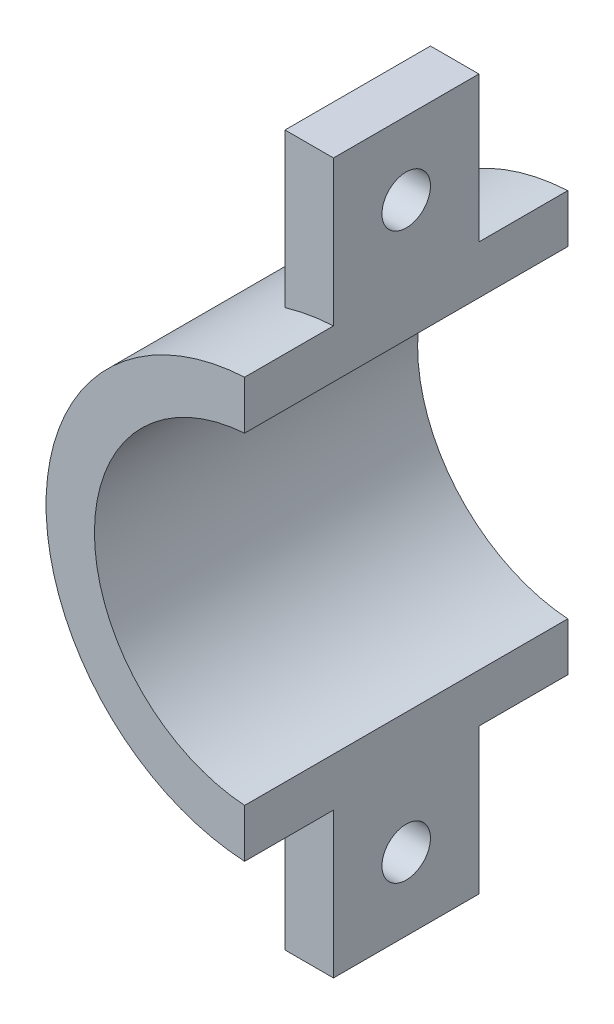
ISO-10303-21;
HEADER;
FILE_DESCRIPTION(('STEP AP214'),'2;1');
FILE_NAME('part.step','',(''),(''),'','','');
FILE_SCHEMA(('AUTOMOTIVE_DESIGN { 1 0 10303 214 1 1 1 1 }'));
ENDSEC;
DATA;
#1=APPLICATION_CONTEXT('core data for automotive mechanical design processes');
#2=APPLICATION_PROTOCOL_DEFINITION('international standard','automotive_design',2000,#1);
#3=PRODUCT_CONTEXT('',#1,'mechanical');
#4=PRODUCT('Part','Part','',(#3));
#5=PRODUCT_RELATED_PRODUCT_CATEGORY('part','',(#4));
#6=PRODUCT_DEFINITION_FORMATION('','',#4);
#7=PRODUCT_DEFINITION_CONTEXT('part definition',#1,'design');
#8=PRODUCT_DEFINITION('design','',#6,#7);
#9=PRODUCT_DEFINITION_SHAPE('','',#8);
#10=(LENGTH_UNIT() NAMED_UNIT(*) SI_UNIT(.MILLI.,.METRE.));
#11=(NAMED_UNIT(*) PLANE_ANGLE_UNIT() SI_UNIT($,.RADIAN.));
#12=(NAMED_UNIT(*) SI_UNIT($,.STERADIAN.) SOLID_ANGLE_UNIT());
#13=UNCERTAINTY_MEASURE_WITH_UNIT(LENGTH_MEASURE(1.E-05),#10,'distance_accuracy_value','');
#14=(GEOMETRIC_REPRESENTATION_CONTEXT(3) GLOBAL_UNCERTAINTY_ASSIGNED_CONTEXT((#13)) GLOBAL_UNIT_ASSIGNED_CONTEXT((#10,
#11,#12)) REPRESENTATION_CONTEXT('',''));
#15=CARTESIAN_POINT('',(0.,0.,0.));
#16=DIRECTION('',(0.,0.,1.));
#17=DIRECTION('',(1.,0.,0.));
#18=AXIS2_PLACEMENT_3D('',#15,#16,#17);
#19=CARTESIAN_POINT('',(0.,0.,20.));
#20=DIRECTION('',(0.,0.,-1.));
#21=DIRECTION('',(-1.,0.,0.));
#22=AXIS2_PLACEMENT_3D('',#19,#20,#21);
#23=CYLINDRICAL_SURFACE('',#22,10.0000000000001);
#24=CARTESIAN_POINT('',(0.,0.,0.));
#25=DIRECTION('',(0.,0.,-1.));
#26=DIRECTION('',(1.,0.,0.));
#27=AXIS2_PLACEMENT_3D('',#24,#25,#26);
#28=CIRCLE('',#27,10.0000000000001);
#29=CARTESIAN_POINT('',(-0.706664701255969,-9.97499999999999,0.));
#30=VERTEX_POINT('',#29);
#31=CARTESIAN_POINT('',(-0.706664701255889,9.975,0.));
#32=VERTEX_POINT('',#31);
#33=EDGE_CURVE('E209',#30,#32,#28,.T.);
#34=ORIENTED_EDGE('',*,*,#33,.T.);
#35=DIRECTION('',(0.,0.,-1.));
#36=VECTOR('',#35,1.);
#37=CARTESIAN_POINT('',(-0.706664701255889,9.975,20.));
#38=LINE('',#37,#36);
#39=CARTESIAN_POINT('',(-0.706664701255889,9.975,20.));
#40=VERTEX_POINT('',#39);
#41=EDGE_CURVE('E253',#40,#32,#38,.T.);
#42=ORIENTED_EDGE('',*,*,#41,.F.);
#43=CARTESIAN_POINT('',(0.,0.,20.));
#44=DIRECTION('',(0.,0.,-1.));
#45=DIRECTION('',(1.,0.,0.));
#46=AXIS2_PLACEMENT_3D('',#43,#44,#45);
#47=CIRCLE('',#46,10.0000000000001);
#48=CARTESIAN_POINT('',(-0.706664701255969,-9.97499999999999,20.));
#49=VERTEX_POINT('',#48);
#50=EDGE_CURVE('E213',#49,#40,#47,.T.);
#51=ORIENTED_EDGE('',*,*,#50,.F.);
#52=DIRECTION('',(0.,0.,-1.));
#53=VECTOR('',#52,1.);
#54=CARTESIAN_POINT('',(-0.706664701255969,-9.97499999999999,20.));
#55=LINE('',#54,#53);
#56=EDGE_CURVE('E227',#49,#30,#55,.T.);
#57=ORIENTED_EDGE('',*,*,#56,.T.);
#58=EDGE_LOOP('',(#34,#42,#51,#57));
#59=FACE_BOUND('',#58,.T.);
#60=ADVANCED_FACE('F39',(#59),#23,.F.);
#61=CARTESIAN_POINT('',(-0.706664701255889,9.975,20.));
#62=DIRECTION('',(-1.,0.,0.));
#63=DIRECTION('',(0.,0.,1.));
#64=AXIS2_PLACEMENT_3D('',#61,#62,#63);
#65=PLANE('',#64);
#66=DIRECTION('',(0.,0.,-1.));
#67=VECTOR('',#66,1.);
#68=CARTESIAN_POINT('',(-0.706664701255889,12.975,20.));
#69=LINE('',#68,#67);
#70=CARTESIAN_POINT('',(-0.706664701255889,12.975,5.5));
#71=VERTEX_POINT('',#70);
#72=CARTESIAN_POINT('',(-0.706664701255889,12.975,0.));
#73=VERTEX_POINT('',#72);
#74=EDGE_CURVE('E249',#71,#73,#69,.T.);
#75=ORIENTED_EDGE('',*,*,#74,.F.);
#76=DIRECTION('',(0.,1.,0.));
#77=VECTOR('',#76,1.);
#78=CARTESIAN_POINT('',(-0.706664701255889,21.975,5.5));
#79=LINE('',#78,#77);
#80=CARTESIAN_POINT('',(-0.706664701255889,21.975,5.5));
#81=VERTEX_POINT('',#80);
#82=EDGE_CURVE('E180',#71,#81,#79,.T.);
#83=ORIENTED_EDGE('',*,*,#82,.T.);
#84=DIRECTION('',(0.,0.,1.));
#85=VECTOR('',#84,1.);
#86=CARTESIAN_POINT('',(-0.706664701255889,21.975,14.5));
#87=LINE('',#86,#85);
#88=CARTESIAN_POINT('',(-0.706664701255889,21.975,14.5));
#89=VERTEX_POINT('',#88);
#90=EDGE_CURVE('E199',#81,#89,#87,.T.);
#91=ORIENTED_EDGE('',*,*,#90,.T.);
#92=DIRECTION('',(0.,-1.,0.));
#93=VECTOR('',#92,1.);
#94=CARTESIAN_POINT('',(-0.706664701255889,9.975,14.5));
#95=LINE('',#94,#93);
#96=CARTESIAN_POINT('',(-0.706664701255889,12.975,14.5));
#97=VERTEX_POINT('',#96);
#98=EDGE_CURVE('E188',#89,#97,#95,.T.);
#99=ORIENTED_EDGE('',*,*,#98,.T.);
#100=CARTESIAN_POINT('',(-0.706664701255889,12.975,20.));
#101=VERTEX_POINT('',#100);
#102=EDGE_CURVE('E250',#101,#97,#69,.T.);
#103=ORIENTED_EDGE('',*,*,#102,.F.);
#104=DIRECTION('',(0.,1.,0.));
#105=VECTOR('',#104,1.);
#106=CARTESIAN_POINT('',(-0.706664701255889,9.975,20.));
#107=LINE('',#106,#105);
#108=EDGE_CURVE('E217',#40,#101,#107,.T.);
#109=ORIENTED_EDGE('',*,*,#108,.F.);
#110=ORIENTED_EDGE('',*,*,#41,.T.);
#111=DIRECTION('',(0.,1.,0.));
#112=VECTOR('',#111,1.);
#113=CARTESIAN_POINT('',(-0.706664701255889,9.975,0.));
#114=LINE('',#113,#112);
#115=EDGE_CURVE('E231',#32,#73,#114,.T.);
#116=ORIENTED_EDGE('',*,*,#115,.T.);
#117=EDGE_LOOP('',(#75,#83,#91,#99,#103,#109,#110,#116));
#118=FACE_BOUND('',#117,.T.);
#119=CARTESIAN_POINT('',(-0.706664701255889,17.475,10.));
#120=DIRECTION('',(1.,0.,0.));
#121=DIRECTION('',(0.,0.,-1.));
#122=AXIS2_PLACEMENT_3D('',#119,#120,#121);
#123=CIRCLE('',#122,1.5);
#124=CARTESIAN_POINT('',(-0.706664701255889,17.475,8.5));
#125=VERTEX_POINT('',#124);
#126=EDGE_CURVE('E175',#125,#125,#123,.T.);
#127=ORIENTED_EDGE('',*,*,#126,.F.);
#128=EDGE_LOOP('',(#127));
#129=FACE_BOUND('',#128,.T.);
#130=ADVANCED_FACE('F286',(#118,#129),#65,.F.);
#131=CARTESIAN_POINT('',(0.,0.,20.));
#132=DIRECTION('',(0.,0.,-1.));
#133=DIRECTION('',(-1.,0.,0.));
#134=AXIS2_PLACEMENT_3D('',#131,#132,#133);
#135=CYLINDRICAL_SURFACE('',#134,12.9942294885076);
#136=DIRECTION('',(0.,0.,-1.));
#137=VECTOR('',#136,1.);
#138=CARTESIAN_POINT('',(-0.706664701255976,-12.975,20.));
#139=LINE('',#138,#137);
#140=CARTESIAN_POINT('',(-0.706664701255976,-12.975,5.5));
#141=VERTEX_POINT('',#140);
#142=CARTESIAN_POINT('',(-0.706664701255976,-12.975,0.));
#143=VERTEX_POINT('',#142);
#144=EDGE_CURVE('E244',#141,#143,#139,.T.);
#145=ORIENTED_EDGE('',*,*,#144,.F.);
#146=CARTESIAN_POINT('',(0.,0.,5.5));
#147=DIRECTION('',(0.,0.,-1.));
#148=DIRECTION('',(0.,1.,0.));
#149=AXIS2_PLACEMENT_3D('',#146,#147,#148);
#150=CIRCLE('',#149,12.9942294885076);
#151=CARTESIAN_POINT('',(-3.70666470125589,-12.4543420858938,5.5));
#152=VERTEX_POINT('',#151);
#153=EDGE_CURVE('E171',#141,#152,#150,.T.);
#154=ORIENTED_EDGE('',*,*,#153,.T.);
#155=DIRECTION('',(0.,0.,-1.));
#156=VECTOR('',#155,1.);
#157=CARTESIAN_POINT('',(-3.70666470125589,-12.4543420858938,20.));
#158=LINE('',#157,#156);
#159=CARTESIAN_POINT('',(-3.70666470125589,-12.4543420858938,14.5));
#160=VERTEX_POINT('',#159);
#161=EDGE_CURVE('E11',#160,#152,#158,.T.);
#162=ORIENTED_EDGE('',*,*,#161,.F.);
#163=CARTESIAN_POINT('',(0.,0.,14.5));
#164=DIRECTION('',(0.,0.,1.));
#165=DIRECTION('',(0.,-1.,0.));
#166=AXIS2_PLACEMENT_3D('',#163,#164,#165);
#167=CIRCLE('',#166,12.9942294885076);
#168=CARTESIAN_POINT('',(-0.706664701255889,-12.975,14.5));
#169=VERTEX_POINT('',#168);
#170=EDGE_CURVE('E135',#160,#169,#167,.T.);
#171=ORIENTED_EDGE('',*,*,#170,.T.);
#172=CARTESIAN_POINT('',(-0.706664701255976,-12.975,20.));
#173=VERTEX_POINT('',#172);
#174=EDGE_CURVE('E245',#173,#169,#139,.T.);
#175=ORIENTED_EDGE('',*,*,#174,.F.);
#176=CARTESIAN_POINT('',(0.,0.,20.));
#177=DIRECTION('',(0.,0.,1.));
#178=DIRECTION('',(1.,0.,0.));
#179=AXIS2_PLACEMENT_3D('',#176,#177,#178);
#180=CIRCLE('',#179,12.9942294885076);
#181=EDGE_CURVE('E221',#101,#173,#180,.T.);
#182=ORIENTED_EDGE('',*,*,#181,.F.);
#183=ORIENTED_EDGE('',*,*,#102,.T.);
#184=CARTESIAN_POINT('',(0.,0.,14.5));
#185=DIRECTION('',(0.,0.,1.));
#186=DIRECTION('',(1.,0.,0.));
#187=AXIS2_PLACEMENT_3D('',#184,#185,#186);
#188=CIRCLE('',#187,12.9942294885076);
#189=CARTESIAN_POINT('',(-3.70666470125589,12.4543420858938,14.5));
#190=VERTEX_POINT('',#189);
#191=EDGE_CURVE('E47',#97,#190,#188,.T.);
#192=ORIENTED_EDGE('',*,*,#191,.T.);
#193=DIRECTION('',(0.,0.,-1.));
#194=VECTOR('',#193,1.);
#195=CARTESIAN_POINT('',(-3.70666470125589,12.4543420858938,20.));
#196=LINE('',#195,#194);
#197=CARTESIAN_POINT('',(-3.70666470125589,12.4543420858938,5.5));
#198=VERTEX_POINT('',#197);
#199=EDGE_CURVE('E62',#190,#198,#196,.T.);
#200=ORIENTED_EDGE('',*,*,#199,.T.);
#201=CARTESIAN_POINT('',(0.,0.,5.5));
#202=DIRECTION('',(0.,0.,-1.));
#203=DIRECTION('',(0.,1.,0.));
#204=AXIS2_PLACEMENT_3D('',#201,#202,#203);
#205=CIRCLE('',#204,12.9942294885076);
#206=EDGE_CURVE('E258',#198,#71,#205,.T.);
#207=ORIENTED_EDGE('',*,*,#206,.T.);
#208=ORIENTED_EDGE('',*,*,#74,.T.);
#209=CARTESIAN_POINT('',(0.,0.,0.));
#210=DIRECTION('',(0.,0.,1.));
#211=DIRECTION('',(1.,0.,0.));
#212=AXIS2_PLACEMENT_3D('',#209,#210,#211);
#213=CIRCLE('',#212,12.9942294885076);
#214=EDGE_CURVE('E235',#73,#143,#213,.T.);
#215=ORIENTED_EDGE('',*,*,#214,.T.);
#216=EDGE_LOOP('',(#145,#154,#162,#171,#175,#182,#183,#192,#200,#207,#208,#215));
#217=FACE_BOUND('',#216,.T.);
#218=ADVANCED_FACE('F263',(#217),#135,.T.);
#219=CARTESIAN_POINT('',(-0.706664701255969,-9.97499999999999,20.));
#220=DIRECTION('',(-1.,0.,0.));
#221=DIRECTION('',(0.,0.,1.));
#222=AXIS2_PLACEMENT_3D('',#219,#220,#221);
#223=PLANE('',#222);
#224=ORIENTED_EDGE('',*,*,#174,.T.);
#225=DIRECTION('',(0.,-1.,0.));
#226=VECTOR('',#225,1.);
#227=CARTESIAN_POINT('',(-0.706664701255889,-9.97499999999999,14.5));
#228=LINE('',#227,#226);
#229=CARTESIAN_POINT('',(-0.706664701255889,-21.975,14.5));
#230=VERTEX_POINT('',#229);
#231=EDGE_CURVE('E159',#169,#230,#228,.T.);
#232=ORIENTED_EDGE('',*,*,#231,.T.);
#233=DIRECTION('',(0.,0.,-1.));
#234=VECTOR('',#233,1.);
#235=CARTESIAN_POINT('',(-0.706664701255889,-21.975,14.5));
#236=LINE('',#235,#234);
#237=CARTESIAN_POINT('',(-0.706664701255889,-21.975,5.5));
#238=VERTEX_POINT('',#237);
#239=EDGE_CURVE('E146',#230,#238,#236,.T.);
#240=ORIENTED_EDGE('',*,*,#239,.T.);
#241=DIRECTION('',(0.,1.,0.));
#242=VECTOR('',#241,1.);
#243=CARTESIAN_POINT('',(-0.706664701255889,-21.975,5.5));
#244=LINE('',#243,#242);
#245=EDGE_CURVE('E54',#238,#141,#244,.T.);
#246=ORIENTED_EDGE('',*,*,#245,.T.);
#247=ORIENTED_EDGE('',*,*,#144,.T.);
#248=DIRECTION('',(0.,1.,0.));
#249=VECTOR('',#248,1.);
#250=CARTESIAN_POINT('',(-0.706664701255969,-9.97499999999999,0.));
#251=LINE('',#250,#249);
#252=EDGE_CURVE('E218',#143,#30,#251,.T.);
#253=ORIENTED_EDGE('',*,*,#252,.T.);
#254=ORIENTED_EDGE('',*,*,#56,.F.);
#255=DIRECTION('',(0.,1.,0.));
#256=VECTOR('',#255,1.);
#257=CARTESIAN_POINT('',(-0.706664701255969,-9.97499999999999,20.));
#258=LINE('',#257,#256);
#259=EDGE_CURVE('E224',#173,#49,#258,.T.);
#260=ORIENTED_EDGE('',*,*,#259,.F.);
#261=EDGE_LOOP('',(#224,#232,#240,#246,#247,#253,#254,#260));
#262=FACE_BOUND('',#261,.T.);
#263=CARTESIAN_POINT('',(-0.706664701255889,-17.475,10.));
#264=DIRECTION('',(1.,0.,0.));
#265=DIRECTION('',(0.,0.,-1.));
#266=AXIS2_PLACEMENT_3D('',#263,#264,#265);
#267=CIRCLE('',#266,1.5);
#268=CARTESIAN_POINT('',(-0.706664701255889,-17.475,8.5));
#269=VERTEX_POINT('',#268);
#270=EDGE_CURVE('E351',#269,#269,#267,.T.);
#271=ORIENTED_EDGE('',*,*,#270,.F.);
#272=EDGE_LOOP('',(#271));
#273=FACE_BOUND('',#272,.T.);
#274=ADVANCED_FACE('F293',(#262,#273),#223,.F.);
#275=CARTESIAN_POINT('',(0.,0.,20.));
#276=DIRECTION('',(0.,0.,1.));
#277=DIRECTION('',(1.,0.,0.));
#278=AXIS2_PLACEMENT_3D('',#275,#276,#277);
#279=PLANE('',#278);
#280=ORIENTED_EDGE('',*,*,#50,.T.);
#281=ORIENTED_EDGE('',*,*,#108,.T.);
#282=ORIENTED_EDGE('',*,*,#181,.T.);
#283=ORIENTED_EDGE('',*,*,#259,.T.);
#284=EDGE_LOOP('',(#280,#281,#282,#283));
#285=FACE_BOUND('',#284,.T.);
#286=ADVANCED_FACE('F302',(#285),#279,.T.);
#287=CARTESIAN_POINT('',(0.,0.,0.));
#288=DIRECTION('',(0.,0.,1.));
#289=DIRECTION('',(1.,0.,0.));
#290=AXIS2_PLACEMENT_3D('',#287,#288,#289);
#291=PLANE('',#290);
#292=ORIENTED_EDGE('',*,*,#33,.F.);
#293=ORIENTED_EDGE('',*,*,#252,.F.);
#294=ORIENTED_EDGE('',*,*,#214,.F.);
#295=ORIENTED_EDGE('',*,*,#115,.F.);
#296=EDGE_LOOP('',(#292,#293,#294,#295));
#297=FACE_BOUND('',#296,.T.);
#298=ADVANCED_FACE('F291',(#297),#291,.F.);
#299=CARTESIAN_POINT('',(-3.70666470125589,0.,0.));
#300=DIRECTION('',(-1.,0.,0.));
#301=DIRECTION('',(0.,0.,1.));
#302=AXIS2_PLACEMENT_3D('',#299,#300,#301);
#303=PLANE('',#302);
#304=CARTESIAN_POINT('',(-3.70666470125589,17.475,10.));
#305=DIRECTION('',(1.,0.,0.));
#306=DIRECTION('',(0.,0.,-1.));
#307=AXIS2_PLACEMENT_3D('',#304,#305,#306);
#308=CIRCLE('',#307,1.5);
#309=CARTESIAN_POINT('',(-3.70666470125589,17.475,8.5));
#310=VERTEX_POINT('',#309);
#311=EDGE_CURVE('E176',#310,#310,#308,.T.);
#312=ORIENTED_EDGE('',*,*,#311,.T.);
#313=EDGE_LOOP('',(#312));
#314=FACE_BOUND('',#313,.T.);
#315=ORIENTED_EDGE('',*,*,#199,.F.);
#316=DIRECTION('',(0.,-1.,0.));
#317=VECTOR('',#316,1.);
#318=CARTESIAN_POINT('',(-3.70666470125589,9.975,14.5));
#319=LINE('',#318,#317);
#320=CARTESIAN_POINT('',(-3.70666470125589,21.975,14.5));
#321=VERTEX_POINT('',#320);
#322=EDGE_CURVE('E192',#321,#190,#319,.T.);
#323=ORIENTED_EDGE('',*,*,#322,.F.);
#324=DIRECTION('',(0.,0.,1.));
#325=VECTOR('',#324,1.);
#326=CARTESIAN_POINT('',(-3.70666470125589,21.975,14.5));
#327=LINE('',#326,#325);
#328=CARTESIAN_POINT('',(-3.70666470125589,21.975,5.5));
#329=VERTEX_POINT('',#328);
#330=EDGE_CURVE('E187',#329,#321,#327,.T.);
#331=ORIENTED_EDGE('',*,*,#330,.F.);
#332=DIRECTION('',(0.,1.,0.));
#333=VECTOR('',#332,1.);
#334=CARTESIAN_POINT('',(-3.70666470125589,21.975,5.5));
#335=LINE('',#334,#333);
#336=EDGE_CURVE('E184',#198,#329,#335,.T.);
#337=ORIENTED_EDGE('',*,*,#336,.F.);
#338=EDGE_LOOP('',(#315,#323,#331,#337));
#339=FACE_BOUND('',#338,.T.);
#340=ADVANCED_FACE('F271',(#314,#339),#303,.T.);
#341=CARTESIAN_POINT('',(-3.70666470125589,9.975,14.5));
#342=DIRECTION('',(0.,0.,1.));
#343=DIRECTION('',(1.,0.,0.));
#344=AXIS2_PLACEMENT_3D('',#341,#342,#343);
#345=PLANE('',#344);
#346=ORIENTED_EDGE('',*,*,#191,.F.);
#347=ORIENTED_EDGE('',*,*,#98,.F.);
#348=DIRECTION('',(1.,0.,0.));
#349=VECTOR('',#348,1.);
#350=CARTESIAN_POINT('',(-3.70666470125589,21.975,14.5));
#351=LINE('',#350,#349);
#352=EDGE_CURVE('E206',#321,#89,#351,.T.);
#353=ORIENTED_EDGE('',*,*,#352,.F.);
#354=ORIENTED_EDGE('',*,*,#322,.T.);
#355=EDGE_LOOP('',(#346,#347,#353,#354));
#356=FACE_BOUND('',#355,.T.);
#357=ADVANCED_FACE('F273',(#356),#345,.T.);
#358=CARTESIAN_POINT('',(-3.70666470125589,21.975,14.5));
#359=DIRECTION('',(0.,1.,0.));
#360=DIRECTION('',(0.,0.,1.));
#361=AXIS2_PLACEMENT_3D('',#358,#359,#360);
#362=PLANE('',#361);
#363=ORIENTED_EDGE('',*,*,#90,.F.);
#364=DIRECTION('',(1.,0.,0.));
#365=VECTOR('',#364,1.);
#366=CARTESIAN_POINT('',(-3.70666470125589,21.975,5.5));
#367=LINE('',#366,#365);
#368=EDGE_CURVE('E196',#329,#81,#367,.T.);
#369=ORIENTED_EDGE('',*,*,#368,.F.);
#370=ORIENTED_EDGE('',*,*,#330,.T.);
#371=ORIENTED_EDGE('',*,*,#352,.T.);
#372=EDGE_LOOP('',(#363,#369,#370,#371));
#373=FACE_BOUND('',#372,.T.);
#374=ADVANCED_FACE('F276',(#373),#362,.T.);
#375=CARTESIAN_POINT('',(-3.70666470125589,21.975,5.5));
#376=DIRECTION('',(0.,0.,-1.));
#377=DIRECTION('',(0.,1.,0.));
#378=AXIS2_PLACEMENT_3D('',#375,#376,#377);
#379=PLANE('',#378);
#380=ORIENTED_EDGE('',*,*,#206,.F.);
#381=ORIENTED_EDGE('',*,*,#336,.T.);
#382=ORIENTED_EDGE('',*,*,#368,.T.);
#383=ORIENTED_EDGE('',*,*,#82,.F.);
#384=EDGE_LOOP('',(#380,#381,#382,#383));
#385=FACE_BOUND('',#384,.T.);
#386=ADVANCED_FACE('F280',(#385),#379,.T.);
#387=CARTESIAN_POINT('',(-3.70666470125589,17.475,10.));
#388=DIRECTION('',(1.,0.,0.));
#389=DIRECTION('',(0.,0.,-1.));
#390=AXIS2_PLACEMENT_3D('',#387,#388,#389);
#391=CYLINDRICAL_SURFACE('',#390,1.5);
#392=ORIENTED_EDGE('',*,*,#311,.F.);
#393=EDGE_LOOP('',(#392));
#394=FACE_BOUND('',#393,.T.);
#395=ORIENTED_EDGE('',*,*,#126,.T.);
#396=EDGE_LOOP('',(#395));
#397=FACE_BOUND('',#396,.T.);
#398=ADVANCED_FACE('F321',(#394,#397),#391,.F.);
#399=CARTESIAN_POINT('',(-3.70666470125589,0.,0.));
#400=DIRECTION('',(1.,0.,0.));
#401=DIRECTION('',(0.,0.,-1.));
#402=AXIS2_PLACEMENT_3D('',#399,#400,#401);
#403=PLANE('',#402);
#404=CARTESIAN_POINT('',(-3.70666470125589,-17.475,10.));
#405=DIRECTION('',(1.,0.,0.));
#406=DIRECTION('',(0.,0.,-1.));
#407=AXIS2_PLACEMENT_3D('',#404,#405,#406);
#408=CIRCLE('',#407,1.5);
#409=CARTESIAN_POINT('',(-3.70666470125589,-17.475,8.5));
#410=VERTEX_POINT('',#409);
#411=EDGE_CURVE('E162',#410,#410,#408,.T.);
#412=ORIENTED_EDGE('',*,*,#411,.T.);
#413=EDGE_LOOP('',(#412));
#414=FACE_BOUND('',#413,.T.);
#415=DIRECTION('',(0.,-1.,0.));
#416=VECTOR('',#415,1.);
#417=CARTESIAN_POINT('',(-3.70666470125589,-9.97499999999999,14.5));
#418=LINE('',#417,#416);
#419=CARTESIAN_POINT('',(-3.70666470125589,-21.975,14.5));
#420=VERTEX_POINT('',#419);
#421=EDGE_CURVE('E129',#160,#420,#418,.T.);
#422=ORIENTED_EDGE('',*,*,#421,.F.);
#423=ORIENTED_EDGE('',*,*,#161,.T.);
#424=DIRECTION('',(0.,1.,0.));
#425=VECTOR('',#424,1.);
#426=CARTESIAN_POINT('',(-3.70666470125589,-21.975,5.5));
#427=LINE('',#426,#425);
#428=CARTESIAN_POINT('',(-3.70666470125589,-21.975,5.5));
#429=VERTEX_POINT('',#428);
#430=EDGE_CURVE('E149',#429,#152,#427,.T.);
#431=ORIENTED_EDGE('',*,*,#430,.F.);
#432=DIRECTION('',(0.,0.,-1.));
#433=VECTOR('',#432,1.);
#434=CARTESIAN_POINT('',(-3.70666470125589,-21.975,14.5));
#435=LINE('',#434,#433);
#436=EDGE_CURVE('E140',#420,#429,#435,.T.);
#437=ORIENTED_EDGE('',*,*,#436,.F.);
#438=EDGE_LOOP('',(#422,#423,#431,#437));
#439=FACE_BOUND('',#438,.T.);
#440=ADVANCED_FACE('F151',(#414,#439),#403,.F.);
#441=CARTESIAN_POINT('',(-3.70666470125589,-21.975,5.5));
#442=DIRECTION('',(0.,0.,-1.));
#443=DIRECTION('',(0.,1.,0.));
#444=AXIS2_PLACEMENT_3D('',#441,#442,#443);
#445=PLANE('',#444);
#446=ORIENTED_EDGE('',*,*,#153,.F.);
#447=ORIENTED_EDGE('',*,*,#245,.F.);
#448=DIRECTION('',(1.,0.,0.));
#449=VECTOR('',#448,1.);
#450=CARTESIAN_POINT('',(-3.70666470125589,-21.975,5.5));
#451=LINE('',#450,#449);
#452=EDGE_CURVE('E148',#429,#238,#451,.T.);
#453=ORIENTED_EDGE('',*,*,#452,.F.);
#454=ORIENTED_EDGE('',*,*,#430,.T.);
#455=EDGE_LOOP('',(#446,#447,#453,#454));
#456=FACE_BOUND('',#455,.T.);
#457=ADVANCED_FACE('F299',(#456),#445,.T.);
#458=CARTESIAN_POINT('',(-3.70666470125589,-9.97499999999999,14.5));
#459=DIRECTION('',(0.,0.,1.));
#460=DIRECTION('',(0.,-1.,0.));
#461=AXIS2_PLACEMENT_3D('',#458,#459,#460);
#462=PLANE('',#461);
#463=ORIENTED_EDGE('',*,*,#170,.F.);
#464=ORIENTED_EDGE('',*,*,#421,.T.);
#465=DIRECTION('',(1.,0.,0.));
#466=VECTOR('',#465,1.);
#467=CARTESIAN_POINT('',(-3.70666470125589,-21.975,14.5));
#468=LINE('',#467,#466);
#469=EDGE_CURVE('E132',#420,#230,#468,.T.);
#470=ORIENTED_EDGE('',*,*,#469,.T.);
#471=ORIENTED_EDGE('',*,*,#231,.F.);
#472=EDGE_LOOP('',(#463,#464,#470,#471));
#473=FACE_BOUND('',#472,.T.);
#474=ADVANCED_FACE('F131',(#473),#462,.T.);
#475=CARTESIAN_POINT('',(-3.70666470125589,-21.975,14.5));
#476=DIRECTION('',(0.,-1.,0.));
#477=DIRECTION('',(0.,0.,-1.));
#478=AXIS2_PLACEMENT_3D('',#475,#476,#477);
#479=PLANE('',#478);
#480=ORIENTED_EDGE('',*,*,#239,.F.);
#481=ORIENTED_EDGE('',*,*,#469,.F.);
#482=ORIENTED_EDGE('',*,*,#436,.T.);
#483=ORIENTED_EDGE('',*,*,#452,.T.);
#484=EDGE_LOOP('',(#480,#481,#482,#483));
#485=FACE_BOUND('',#484,.T.);
#486=ADVANCED_FACE('F144',(#485),#479,.T.);
#487=CARTESIAN_POINT('',(-3.70666470125589,-17.475,10.));
#488=DIRECTION('',(1.,0.,0.));
#489=DIRECTION('',(0.,0.,-1.));
#490=AXIS2_PLACEMENT_3D('',#487,#488,#489);
#491=CYLINDRICAL_SURFACE('',#490,1.5);
#492=ORIENTED_EDGE('',*,*,#411,.F.);
#493=EDGE_LOOP('',(#492));
#494=FACE_BOUND('',#493,.T.);
#495=ORIENTED_EDGE('',*,*,#270,.T.);
#496=EDGE_LOOP('',(#495));
#497=FACE_BOUND('',#496,.T.);
#498=ADVANCED_FACE('F336',(#494,#497),#491,.F.);
#499=CLOSED_SHELL('',(#60,#130,#218,#274,#286,#298,#340,#357,#374,#386,#398,#440,#457,#474,#486,#498));
#500=MANIFOLD_SOLID_BREP('B2',#499);
#501=ADVANCED_BREP_SHAPE_REPRESENTATION('',(#18,#500),#14);
#502=SHAPE_DEFINITION_REPRESENTATION(#9,#501);
ENDSEC;
END-ISO-10303-21;
